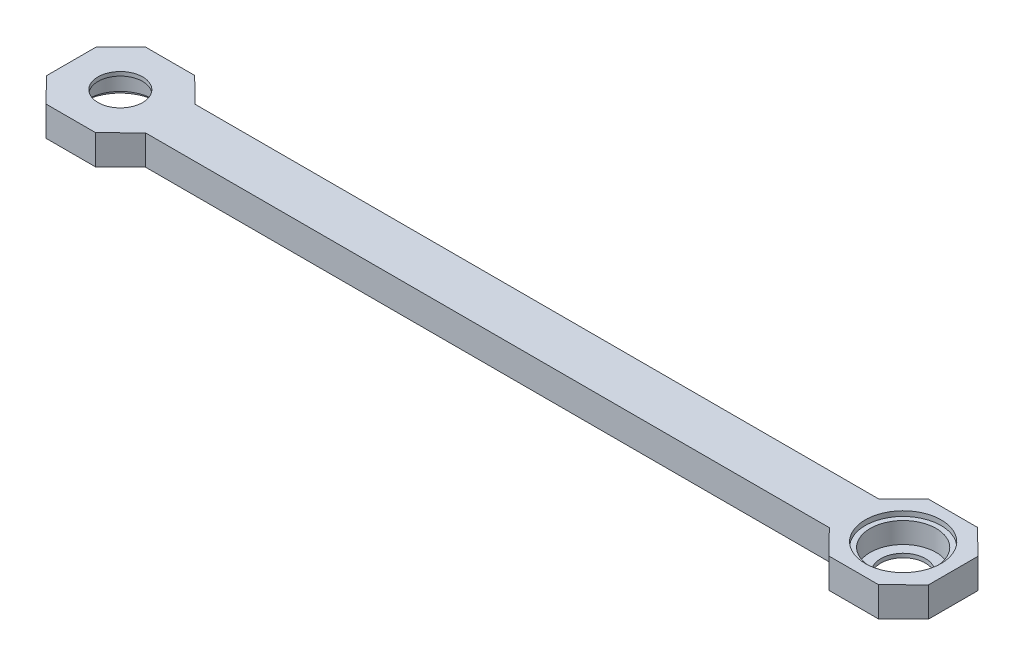
ISO-10303-21;
HEADER;
FILE_DESCRIPTION(('STEP AP214'),'2;1');
FILE_NAME('part.step','',(''),(''),'','','');
FILE_SCHEMA(('AUTOMOTIVE_DESIGN { 1 0 10303 214 1 1 1 1 }'));
ENDSEC;
DATA;
#1=APPLICATION_CONTEXT('core data for automotive mechanical design processes');
#2=APPLICATION_PROTOCOL_DEFINITION('international standard','automotive_design',2000,#1);
#3=PRODUCT_CONTEXT('',#1,'mechanical');
#4=PRODUCT('Part','Part','',(#3));
#5=PRODUCT_RELATED_PRODUCT_CATEGORY('part','',(#4));
#6=PRODUCT_DEFINITION_FORMATION('','',#4);
#7=PRODUCT_DEFINITION_CONTEXT('part definition',#1,'design');
#8=PRODUCT_DEFINITION('design','',#6,#7);
#9=PRODUCT_DEFINITION_SHAPE('','',#8);
#10=(LENGTH_UNIT() NAMED_UNIT(*) SI_UNIT(.MILLI.,.METRE.));
#11=(NAMED_UNIT(*) PLANE_ANGLE_UNIT() SI_UNIT($,.RADIAN.));
#12=(NAMED_UNIT(*) SI_UNIT($,.STERADIAN.) SOLID_ANGLE_UNIT());
#13=UNCERTAINTY_MEASURE_WITH_UNIT(LENGTH_MEASURE(1.E-05),#10,'distance_accuracy_value','');
#14=(GEOMETRIC_REPRESENTATION_CONTEXT(3) GLOBAL_UNCERTAINTY_ASSIGNED_CONTEXT((#13)) GLOBAL_UNIT_ASSIGNED_CONTEXT((#10,
#11,#12)) REPRESENTATION_CONTEXT('',''));
#15=CARTESIAN_POINT('',(0.,0.,0.));
#16=DIRECTION('',(0.,0.,1.));
#17=DIRECTION('',(1.,0.,0.));
#18=AXIS2_PLACEMENT_3D('',#15,#16,#17);
#19=CARTESIAN_POINT('',(-75.3633444841573,5.2,0.));
#20=DIRECTION('',(0.,-1.,0.));
#21=DIRECTION('',(0.,0.,-1.));
#22=AXIS2_PLACEMENT_3D('',#19,#20,#21);
#23=CYLINDRICAL_SURFACE('',#22,6.65000000000001);
#24=CARTESIAN_POINT('',(-75.3633444841573,5.2,0.));
#25=DIRECTION('',(0.,-1.,0.));
#26=DIRECTION('',(0.,0.,-1.));
#27=AXIS2_PLACEMENT_3D('',#24,#25,#26);
#28=CIRCLE('',#27,6.65000000000001);
#29=CARTESIAN_POINT('',(-75.3633444841573,5.2,-6.65000000000001));
#30=VERTEX_POINT('',#29);
#31=EDGE_CURVE('E261',#30,#30,#28,.T.);
#32=ORIENTED_EDGE('',*,*,#31,.F.);
#33=EDGE_LOOP('',(#32));
#34=FACE_BOUND('',#33,.T.);
#35=CARTESIAN_POINT('',(-75.3633444841573,1.,0.));
#36=DIRECTION('',(0.,-1.,0.));
#37=DIRECTION('',(0.,0.,-1.));
#38=AXIS2_PLACEMENT_3D('',#35,#36,#37);
#39=CIRCLE('',#38,6.65000000000001);
#40=CARTESIAN_POINT('',(-75.3633444841573,1.,-6.65000000000001));
#41=VERTEX_POINT('',#40);
#42=EDGE_CURVE('E39',#41,#41,#39,.F.);
#43=ORIENTED_EDGE('',*,*,#42,.F.);
#44=EDGE_LOOP('',(#43));
#45=FACE_BOUND('',#44,.T.);
#46=ADVANCED_FACE('F35',(#34,#45),#23,.F.);
#47=CARTESIAN_POINT('',(-75.3633444841573,6.,0.));
#48=DIRECTION('',(0.,-1.,0.));
#49=DIRECTION('',(0.,0.,-1.));
#50=AXIS2_PLACEMENT_3D('',#47,#48,#49);
#51=CYLINDRICAL_SURFACE('',#50,4.5);
#52=CARTESIAN_POINT('',(-75.3633444841573,6.,0.));
#53=DIRECTION('',(0.,1.,0.));
#54=DIRECTION('',(0.,0.,1.));
#55=AXIS2_PLACEMENT_3D('',#52,#53,#54);
#56=CIRCLE('',#55,4.5);
#57=CARTESIAN_POINT('',(-75.3633444841573,6.,4.5));
#58=VERTEX_POINT('',#57);
#59=EDGE_CURVE('E187',#58,#58,#56,.T.);
#60=ORIENTED_EDGE('',*,*,#59,.T.);
#61=EDGE_LOOP('',(#60));
#62=FACE_BOUND('',#61,.T.);
#63=CARTESIAN_POINT('',(-75.3633444841573,5.2,0.));
#64=DIRECTION('',(0.,-1.,0.));
#65=DIRECTION('',(0.,0.,-1.));
#66=AXIS2_PLACEMENT_3D('',#63,#64,#65);
#67=CIRCLE('',#66,4.5);
#68=CARTESIAN_POINT('',(-75.3633444841573,5.2,-4.5));
#69=VERTEX_POINT('',#68);
#70=EDGE_CURVE('E258',#69,#69,#67,.T.);
#71=ORIENTED_EDGE('',*,*,#70,.T.);
#72=EDGE_LOOP('',(#71));
#73=FACE_BOUND('',#72,.T.);
#74=ADVANCED_FACE('F337',(#62,#73),#51,.F.);
#75=CARTESIAN_POINT('',(82.6366555158427,0.8,0.));
#76=DIRECTION('',(0.,1.,0.));
#77=DIRECTION('',(0.,0.,1.));
#78=AXIS2_PLACEMENT_3D('',#75,#76,#77);
#79=CYLINDRICAL_SURFACE('',#78,6.65000000000001);
#80=CARTESIAN_POINT('',(82.6366555158427,0.8,0.));
#81=DIRECTION('',(0.,1.,0.));
#82=DIRECTION('',(0.,0.,1.));
#83=AXIS2_PLACEMENT_3D('',#80,#81,#82);
#84=CIRCLE('',#83,6.65000000000001);
#85=CARTESIAN_POINT('',(82.6366555158427,0.8,6.65000000000001));
#86=VERTEX_POINT('',#85);
#87=EDGE_CURVE('E254',#86,#86,#84,.T.);
#88=ORIENTED_EDGE('',*,*,#87,.F.);
#89=EDGE_LOOP('',(#88));
#90=FACE_BOUND('',#89,.T.);
#91=CARTESIAN_POINT('',(82.6366555158427,5.,0.));
#92=DIRECTION('',(0.,1.,0.));
#93=DIRECTION('',(0.,0.,1.));
#94=AXIS2_PLACEMENT_3D('',#91,#92,#93);
#95=CIRCLE('',#94,6.65000000000001);
#96=CARTESIAN_POINT('',(82.6366555158427,5.,6.65000000000001));
#97=VERTEX_POINT('',#96);
#98=EDGE_CURVE('E255',#97,#97,#95,.F.);
#99=ORIENTED_EDGE('',*,*,#98,.F.);
#100=EDGE_LOOP('',(#99));
#101=FACE_BOUND('',#100,.T.);
#102=ADVANCED_FACE('F343',(#90,#101),#79,.F.);
#103=CARTESIAN_POINT('',(82.6366555158427,6.,0.));
#104=DIRECTION('',(0.,-1.,0.));
#105=DIRECTION('',(0.,0.,-1.));
#106=AXIS2_PLACEMENT_3D('',#103,#104,#105);
#107=CYLINDRICAL_SURFACE('',#106,4.5);
#108=CARTESIAN_POINT('',(82.6366555158427,0.,0.));
#109=DIRECTION('',(0.,1.,0.));
#110=DIRECTION('',(0.,0.,1.));
#111=AXIS2_PLACEMENT_3D('',#108,#109,#110);
#112=CIRCLE('',#111,4.5);
#113=CARTESIAN_POINT('',(82.6366555158427,0.,4.5));
#114=VERTEX_POINT('',#113);
#115=EDGE_CURVE('E253',#114,#114,#112,.T.);
#116=ORIENTED_EDGE('',*,*,#115,.F.);
#117=EDGE_LOOP('',(#116));
#118=FACE_BOUND('',#117,.T.);
#119=CARTESIAN_POINT('',(82.6366555158427,0.8,0.));
#120=DIRECTION('',(0.,1.,0.));
#121=DIRECTION('',(0.,0.,1.));
#122=AXIS2_PLACEMENT_3D('',#119,#120,#121);
#123=CIRCLE('',#122,4.5);
#124=CARTESIAN_POINT('',(82.6366555158427,0.8,4.5));
#125=VERTEX_POINT('',#124);
#126=EDGE_CURVE('E250',#125,#125,#123,.T.);
#127=ORIENTED_EDGE('',*,*,#126,.T.);
#128=EDGE_LOOP('',(#127));
#129=FACE_BOUND('',#128,.T.);
#130=ADVANCED_FACE('F360',(#118,#129),#107,.F.);
#131=CARTESIAN_POINT('',(0.,6.,0.));
#132=DIRECTION('',(0.,-1.,0.));
#133=DIRECTION('',(0.,0.,-1.));
#134=AXIS2_PLACEMENT_3D('',#131,#132,#133);
#135=PLANE('',#134);
#136=CARTESIAN_POINT('',(82.6366555158427,6.,0.));
#137=DIRECTION('',(0.,1.,0.));
#138=DIRECTION('',(0.,0.,1.));
#139=AXIS2_PLACEMENT_3D('',#136,#137,#138);
#140=CIRCLE('',#139,7.65);
#141=CARTESIAN_POINT('',(82.6366555158427,6.,7.65));
#142=VERTEX_POINT('',#141);
#143=EDGE_CURVE('E260',#142,#142,#140,.T.);
#144=ORIENTED_EDGE('',*,*,#143,.F.);
#145=EDGE_LOOP('',(#144));
#146=FACE_BOUND('',#145,.T.);
#147=DIRECTION('',(-1.,0.,0.));
#148=VECTOR('',#147,1.);
#149=CARTESIAN_POINT('',(-65.2623239697237,6.,-5.));
#150=LINE('',#149,#148);
#151=CARTESIAN_POINT('',(72.7376760302763,6.,-5.));
#152=VERTEX_POINT('',#151);
#153=CARTESIAN_POINT('',(-65.2623239697237,6.,-5.));
#154=VERTEX_POINT('',#153);
#155=EDGE_CURVE('E214',#152,#154,#150,.T.);
#156=ORIENTED_EDGE('',*,*,#155,.T.);
#157=DIRECTION('',(-0.714142857145832,0.,-0.699999985419706));
#158=VECTOR('',#157,1.);
#159=CARTESIAN_POINT('',(-65.2623239697237,6.,-5.));
#160=LINE('',#159,#158);
#161=CARTESIAN_POINT('',(-70.3633444841573,6.,-10.));
#162=VERTEX_POINT('',#161);
#163=EDGE_CURVE('E121',#154,#162,#160,.T.);
#164=ORIENTED_EDGE('',*,*,#163,.T.);
#165=DIRECTION('',(-1.,0.,0.));
#166=VECTOR('',#165,1.);
#167=CARTESIAN_POINT('',(-70.3633444841573,6.,-10.));
#168=LINE('',#167,#166);
#169=CARTESIAN_POINT('',(-80.3633444841573,6.,-10.));
#170=VERTEX_POINT('',#169);
#171=EDGE_CURVE('E286',#162,#170,#168,.T.);
#172=ORIENTED_EDGE('',*,*,#171,.T.);
#173=DIRECTION('',(-0.699854212223766,0.,0.714285714285714));
#174=VECTOR('',#173,1.);
#175=CARTESIAN_POINT('',(-80.3633444841573,6.,-10.));
#176=LINE('',#175,#174);
#177=CARTESIAN_POINT('',(-85.2623239697237,6.,-5.));
#178=VERTEX_POINT('',#177);
#179=EDGE_CURVE('E288',#170,#178,#176,.T.);
#180=ORIENTED_EDGE('',*,*,#179,.T.);
#181=DIRECTION('',(0.,0.,1.));
#182=VECTOR('',#181,1.);
#183=CARTESIAN_POINT('',(-85.2623239697237,6.,-5.));
#184=LINE('',#183,#182);
#185=CARTESIAN_POINT('',(-85.2623239697237,6.,5.));
#186=VERTEX_POINT('',#185);
#187=EDGE_CURVE('E290',#178,#186,#184,.T.);
#188=ORIENTED_EDGE('',*,*,#187,.T.);
#189=DIRECTION('',(0.699854212223766,0.,0.714285714285714));
#190=VECTOR('',#189,1.);
#191=CARTESIAN_POINT('',(-80.3633444841573,6.,10.));
#192=LINE('',#191,#190);
#193=CARTESIAN_POINT('',(-80.3633444841573,6.,10.));
#194=VERTEX_POINT('',#193);
#195=EDGE_CURVE('E292',#186,#194,#192,.T.);
#196=ORIENTED_EDGE('',*,*,#195,.T.);
#197=DIRECTION('',(1.,0.,0.));
#198=VECTOR('',#197,1.);
#199=CARTESIAN_POINT('',(-70.3633444841573,6.,10.));
#200=LINE('',#199,#198);
#201=CARTESIAN_POINT('',(-70.3633444841573,6.,10.));
#202=VERTEX_POINT('',#201);
#203=EDGE_CURVE('E294',#194,#202,#200,.T.);
#204=ORIENTED_EDGE('',*,*,#203,.T.);
#205=DIRECTION('',(0.714142857145832,0.,-0.699999985419706));
#206=VECTOR('',#205,1.);
#207=CARTESIAN_POINT('',(-65.2623239697237,6.,5.));
#208=LINE('',#207,#206);
#209=CARTESIAN_POINT('',(-65.2623239697237,6.,5.));
#210=VERTEX_POINT('',#209);
#211=EDGE_CURVE('E296',#202,#210,#208,.T.);
#212=ORIENTED_EDGE('',*,*,#211,.T.);
#213=DIRECTION('',(1.,0.,0.));
#214=VECTOR('',#213,1.);
#215=CARTESIAN_POINT('',(72.7376760302763,6.,5.));
#216=LINE('',#215,#214);
#217=CARTESIAN_POINT('',(72.7376760302763,6.,5.));
#218=VERTEX_POINT('',#217);
#219=EDGE_CURVE('E298',#210,#218,#216,.T.);
#220=ORIENTED_EDGE('',*,*,#219,.T.);
#221=DIRECTION('',(0.699854212223765,0.,0.714285714285715));
#222=VECTOR('',#221,1.);
#223=CARTESIAN_POINT('',(72.7376760302763,6.,5.));
#224=LINE('',#223,#222);
#225=CARTESIAN_POINT('',(77.6366555158427,6.,10.));
#226=VERTEX_POINT('',#225);
#227=EDGE_CURVE('E300',#218,#226,#224,.T.);
#228=ORIENTED_EDGE('',*,*,#227,.T.);
#229=DIRECTION('',(1.,0.,0.));
#230=VECTOR('',#229,1.);
#231=CARTESIAN_POINT('',(77.6366555158427,6.,10.));
#232=LINE('',#231,#230);
#233=CARTESIAN_POINT('',(87.6366555158427,6.,10.));
#234=VERTEX_POINT('',#233);
#235=EDGE_CURVE('E302',#226,#234,#232,.T.);
#236=ORIENTED_EDGE('',*,*,#235,.T.);
#237=DIRECTION('',(0.714285714285716,0.,-0.699854212223764));
#238=VECTOR('',#237,1.);
#239=CARTESIAN_POINT('',(87.6366555158427,6.,10.));
#240=LINE('',#239,#238);
#241=CARTESIAN_POINT('',(92.739759146641,6.,5.));
#242=VERTEX_POINT('',#241);
#243=EDGE_CURVE('E304',#234,#242,#240,.T.);
#244=ORIENTED_EDGE('',*,*,#243,.T.);
#245=DIRECTION('',(0.,0.,-1.));
#246=VECTOR('',#245,1.);
#247=CARTESIAN_POINT('',(92.739759146641,6.,-5.));
#248=LINE('',#247,#246);
#249=CARTESIAN_POINT('',(92.739759146641,6.,-5.));
#250=VERTEX_POINT('',#249);
#251=EDGE_CURVE('E165',#242,#250,#248,.T.);
#252=ORIENTED_EDGE('',*,*,#251,.T.);
#253=DIRECTION('',(-0.714285714285716,0.,-0.699854212223764));
#254=VECTOR('',#253,1.);
#255=CARTESIAN_POINT('',(87.6366555158427,6.,-10.));
#256=LINE('',#255,#254);
#257=CARTESIAN_POINT('',(87.6366555158427,6.,-10.));
#258=VERTEX_POINT('',#257);
#259=EDGE_CURVE('E158',#250,#258,#256,.T.);
#260=ORIENTED_EDGE('',*,*,#259,.T.);
#261=DIRECTION('',(-1.,0.,0.));
#262=VECTOR('',#261,1.);
#263=CARTESIAN_POINT('',(77.6366555158427,6.,-10.));
#264=LINE('',#263,#262);
#265=CARTESIAN_POINT('',(77.6366555158427,6.,-10.));
#266=VERTEX_POINT('',#265);
#267=EDGE_CURVE('E163',#258,#266,#264,.T.);
#268=ORIENTED_EDGE('',*,*,#267,.T.);
#269=DIRECTION('',(-0.699854212223765,0.,0.714285714285715));
#270=VECTOR('',#269,1.);
#271=CARTESIAN_POINT('',(72.7376760302763,6.,-5.));
#272=LINE('',#271,#270);
#273=EDGE_CURVE('E54',#266,#152,#272,.T.);
#274=ORIENTED_EDGE('',*,*,#273,.T.);
#275=EDGE_LOOP('',(#156,#164,#172,#180,#188,#196,#204,#212,#220,#228,#236,#244,#252,#260,#268,#274));
#276=FACE_BOUND('',#275,.T.);
#277=ORIENTED_EDGE('',*,*,#59,.F.);
#278=EDGE_LOOP('',(#277));
#279=FACE_BOUND('',#278,.T.);
#280=ADVANCED_FACE('F160',(#146,#276,#279),#135,.F.);
#281=CARTESIAN_POINT('',(0.,0.,0.));
#282=DIRECTION('',(0.,-1.,0.));
#283=DIRECTION('',(0.,0.,-1.));
#284=AXIS2_PLACEMENT_3D('',#281,#282,#283);
#285=PLANE('',#284);
#286=CARTESIAN_POINT('',(-75.3633444841573,0.,0.));
#287=DIRECTION('',(0.,-1.,0.));
#288=DIRECTION('',(0.,0.,-1.));
#289=AXIS2_PLACEMENT_3D('',#286,#287,#288);
#290=CIRCLE('',#289,7.65);
#291=CARTESIAN_POINT('',(-75.3633444841573,0.,-7.65));
#292=VERTEX_POINT('',#291);
#293=EDGE_CURVE('E274',#292,#292,#290,.T.);
#294=ORIENTED_EDGE('',*,*,#293,.F.);
#295=EDGE_LOOP('',(#294));
#296=FACE_BOUND('',#295,.T.);
#297=DIRECTION('',(-1.,0.,0.));
#298=VECTOR('',#297,1.);
#299=CARTESIAN_POINT('',(-65.2623239697237,0.,-5.));
#300=LINE('',#299,#298);
#301=CARTESIAN_POINT('',(72.7376760302763,0.,-5.));
#302=VERTEX_POINT('',#301);
#303=CARTESIAN_POINT('',(-65.2623239697237,0.,-5.));
#304=VERTEX_POINT('',#303);
#305=EDGE_CURVE('E183',#302,#304,#300,.T.);
#306=ORIENTED_EDGE('',*,*,#305,.F.);
#307=DIRECTION('',(-0.699854212223765,0.,0.714285714285715));
#308=VECTOR('',#307,1.);
#309=CARTESIAN_POINT('',(72.7376760302763,0.,-5.));
#310=LINE('',#309,#308);
#311=CARTESIAN_POINT('',(77.6366555158427,0.,-10.));
#312=VERTEX_POINT('',#311);
#313=EDGE_CURVE('E113',#312,#302,#310,.T.);
#314=ORIENTED_EDGE('',*,*,#313,.F.);
#315=DIRECTION('',(-1.,0.,0.));
#316=VECTOR('',#315,1.);
#317=CARTESIAN_POINT('',(77.6366555158427,0.,-10.));
#318=LINE('',#317,#316);
#319=CARTESIAN_POINT('',(87.6366555158427,0.,-10.));
#320=VERTEX_POINT('',#319);
#321=EDGE_CURVE('E107',#320,#312,#318,.T.);
#322=ORIENTED_EDGE('',*,*,#321,.F.);
#323=DIRECTION('',(-0.714285714285716,0.,-0.699854212223764));
#324=VECTOR('',#323,1.);
#325=CARTESIAN_POINT('',(87.6366555158427,0.,-10.));
#326=LINE('',#325,#324);
#327=CARTESIAN_POINT('',(92.739759146641,0.,-5.));
#328=VERTEX_POINT('',#327);
#329=EDGE_CURVE('E173',#328,#320,#326,.T.);
#330=ORIENTED_EDGE('',*,*,#329,.F.);
#331=DIRECTION('',(0.,0.,-1.));
#332=VECTOR('',#331,1.);
#333=CARTESIAN_POINT('',(92.739759146641,0.,-5.));
#334=LINE('',#333,#332);
#335=CARTESIAN_POINT('',(92.739759146641,0.,5.));
#336=VERTEX_POINT('',#335);
#337=EDGE_CURVE('E209',#336,#328,#334,.T.);
#338=ORIENTED_EDGE('',*,*,#337,.F.);
#339=DIRECTION('',(0.714285714285716,0.,-0.699854212223764));
#340=VECTOR('',#339,1.);
#341=CARTESIAN_POINT('',(87.6366555158427,0.,10.));
#342=LINE('',#341,#340);
#343=CARTESIAN_POINT('',(87.6366555158427,0.,10.));
#344=VERTEX_POINT('',#343);
#345=EDGE_CURVE('E207',#344,#336,#342,.T.);
#346=ORIENTED_EDGE('',*,*,#345,.F.);
#347=DIRECTION('',(1.,0.,0.));
#348=VECTOR('',#347,1.);
#349=CARTESIAN_POINT('',(77.6366555158427,0.,10.));
#350=LINE('',#349,#348);
#351=CARTESIAN_POINT('',(77.6366555158427,0.,10.));
#352=VERTEX_POINT('',#351);
#353=EDGE_CURVE('E205',#352,#344,#350,.T.);
#354=ORIENTED_EDGE('',*,*,#353,.F.);
#355=DIRECTION('',(0.699854212223765,0.,0.714285714285715));
#356=VECTOR('',#355,1.);
#357=CARTESIAN_POINT('',(72.7376760302763,0.,5.));
#358=LINE('',#357,#356);
#359=CARTESIAN_POINT('',(72.7376760302763,0.,5.));
#360=VERTEX_POINT('',#359);
#361=EDGE_CURVE('E203',#360,#352,#358,.T.);
#362=ORIENTED_EDGE('',*,*,#361,.F.);
#363=DIRECTION('',(1.,0.,0.));
#364=VECTOR('',#363,1.);
#365=CARTESIAN_POINT('',(72.7376760302763,0.,5.));
#366=LINE('',#365,#364);
#367=CARTESIAN_POINT('',(-65.2623239697237,0.,5.));
#368=VERTEX_POINT('',#367);
#369=EDGE_CURVE('E201',#368,#360,#366,.T.);
#370=ORIENTED_EDGE('',*,*,#369,.F.);
#371=DIRECTION('',(0.714142857145832,0.,-0.699999985419706));
#372=VECTOR('',#371,1.);
#373=CARTESIAN_POINT('',(-65.2623239697237,0.,5.));
#374=LINE('',#373,#372);
#375=CARTESIAN_POINT('',(-70.3633444841573,0.,10.));
#376=VERTEX_POINT('',#375);
#377=EDGE_CURVE('E199',#376,#368,#374,.T.);
#378=ORIENTED_EDGE('',*,*,#377,.F.);
#379=DIRECTION('',(1.,0.,0.));
#380=VECTOR('',#379,1.);
#381=CARTESIAN_POINT('',(-70.3633444841573,0.,10.));
#382=LINE('',#381,#380);
#383=CARTESIAN_POINT('',(-80.3633444841573,0.,10.));
#384=VERTEX_POINT('',#383);
#385=EDGE_CURVE('E197',#384,#376,#382,.T.);
#386=ORIENTED_EDGE('',*,*,#385,.F.);
#387=DIRECTION('',(0.699854212223766,0.,0.714285714285714));
#388=VECTOR('',#387,1.);
#389=CARTESIAN_POINT('',(-80.3633444841573,0.,10.));
#390=LINE('',#389,#388);
#391=CARTESIAN_POINT('',(-85.2623239697237,0.,5.));
#392=VERTEX_POINT('',#391);
#393=EDGE_CURVE('E195',#392,#384,#390,.T.);
#394=ORIENTED_EDGE('',*,*,#393,.F.);
#395=DIRECTION('',(0.,0.,1.));
#396=VECTOR('',#395,1.);
#397=CARTESIAN_POINT('',(-85.2623239697237,0.,-5.));
#398=LINE('',#397,#396);
#399=CARTESIAN_POINT('',(-85.2623239697237,0.,-5.));
#400=VERTEX_POINT('',#399);
#401=EDGE_CURVE('E193',#400,#392,#398,.T.);
#402=ORIENTED_EDGE('',*,*,#401,.F.);
#403=DIRECTION('',(-0.699854212223766,0.,0.714285714285714));
#404=VECTOR('',#403,1.);
#405=CARTESIAN_POINT('',(-80.3633444841573,0.,-10.));
#406=LINE('',#405,#404);
#407=CARTESIAN_POINT('',(-80.3633444841573,0.,-10.));
#408=VERTEX_POINT('',#407);
#409=EDGE_CURVE('E191',#408,#400,#406,.T.);
#410=ORIENTED_EDGE('',*,*,#409,.F.);
#411=DIRECTION('',(-1.,0.,0.));
#412=VECTOR('',#411,1.);
#413=CARTESIAN_POINT('',(-70.3633444841573,0.,-10.));
#414=LINE('',#413,#412);
#415=CARTESIAN_POINT('',(-70.3633444841573,0.,-10.));
#416=VERTEX_POINT('',#415);
#417=EDGE_CURVE('E189',#416,#408,#414,.T.);
#418=ORIENTED_EDGE('',*,*,#417,.F.);
#419=DIRECTION('',(-0.714142857145832,0.,-0.699999985419706));
#420=VECTOR('',#419,1.);
#421=CARTESIAN_POINT('',(-65.2623239697237,0.,-5.));
#422=LINE('',#421,#420);
#423=EDGE_CURVE('E186',#304,#416,#422,.T.);
#424=ORIENTED_EDGE('',*,*,#423,.F.);
#425=EDGE_LOOP('',(#306,#314,#322,#330,#338,#346,#354,#362,#370,#378,#386,#394,#402,#410,#418,#424));
#426=FACE_BOUND('',#425,.T.);
#427=ORIENTED_EDGE('',*,*,#115,.T.);
#428=EDGE_LOOP('',(#427));
#429=FACE_BOUND('',#428,.T.);
#430=ADVANCED_FACE('F317',(#296,#426,#429),#285,.T.);
#431=CARTESIAN_POINT('',(-65.2623239697237,6.,-5.));
#432=DIRECTION('',(0.,0.,1.));
#433=DIRECTION('',(1.,0.,0.));
#434=AXIS2_PLACEMENT_3D('',#431,#432,#433);
#435=PLANE('',#434);
#436=ORIENTED_EDGE('',*,*,#305,.T.);
#437=DIRECTION('',(0.,-1.,0.));
#438=VECTOR('',#437,1.);
#439=CARTESIAN_POINT('',(-65.2623239697237,6.,-5.));
#440=LINE('',#439,#438);
#441=EDGE_CURVE('E11',#154,#304,#440,.T.);
#442=ORIENTED_EDGE('',*,*,#441,.F.);
#443=ORIENTED_EDGE('',*,*,#155,.F.);
#444=DIRECTION('',(0.,-1.,0.));
#445=VECTOR('',#444,1.);
#446=CARTESIAN_POINT('',(72.7376760302763,6.,-5.));
#447=LINE('',#446,#445);
#448=EDGE_CURVE('E179',#152,#302,#447,.T.);
#449=ORIENTED_EDGE('',*,*,#448,.T.);
#450=EDGE_LOOP('',(#436,#442,#443,#449));
#451=FACE_BOUND('',#450,.T.);
#452=ADVANCED_FACE('F37',(#451),#435,.F.);
#453=CARTESIAN_POINT('',(-65.2623239697237,6.,-5.));
#454=DIRECTION('',(-0.699999985419706,0.,0.714142857145832));
#455=DIRECTION('',(0.714142857145832,0.,0.699999985419706));
#456=AXIS2_PLACEMENT_3D('',#453,#454,#455);
#457=PLANE('',#456);
#458=ORIENTED_EDGE('',*,*,#423,.T.);
#459=DIRECTION('',(0.,-1.,0.));
#460=VECTOR('',#459,1.);
#461=CARTESIAN_POINT('',(-70.3633444841573,6.,-10.));
#462=LINE('',#461,#460);
#463=EDGE_CURVE('E45',#162,#416,#462,.T.);
#464=ORIENTED_EDGE('',*,*,#463,.F.);
#465=ORIENTED_EDGE('',*,*,#163,.F.);
#466=ORIENTED_EDGE('',*,*,#441,.T.);
#467=EDGE_LOOP('',(#458,#464,#465,#466));
#468=FACE_BOUND('',#467,.T.);
#469=ADVANCED_FACE('F372',(#468),#457,.F.);
#470=CARTESIAN_POINT('',(-70.3633444841573,6.,-10.));
#471=DIRECTION('',(0.,0.,1.));
#472=DIRECTION('',(1.,0.,0.));
#473=AXIS2_PLACEMENT_3D('',#470,#471,#472);
#474=PLANE('',#473);
#475=ORIENTED_EDGE('',*,*,#417,.T.);
#476=DIRECTION('',(0.,-1.,0.));
#477=VECTOR('',#476,1.);
#478=CARTESIAN_POINT('',(-80.3633444841573,6.,-10.));
#479=LINE('',#478,#477);
#480=EDGE_CURVE('E245',#170,#408,#479,.T.);
#481=ORIENTED_EDGE('',*,*,#480,.F.);
#482=ORIENTED_EDGE('',*,*,#171,.F.);
#483=ORIENTED_EDGE('',*,*,#463,.T.);
#484=EDGE_LOOP('',(#475,#481,#482,#483));
#485=FACE_BOUND('',#484,.T.);
#486=ADVANCED_FACE('F442',(#485),#474,.F.);
#487=CARTESIAN_POINT('',(-80.3633444841573,6.,-10.));
#488=DIRECTION('',(0.714285714285714,0.,0.699854212223766));
#489=DIRECTION('',(0.699854212223766,0.,-0.714285714285714));
#490=AXIS2_PLACEMENT_3D('',#487,#488,#489);
#491=PLANE('',#490);
#492=ORIENTED_EDGE('',*,*,#409,.T.);
#493=DIRECTION('',(0.,-1.,0.));
#494=VECTOR('',#493,1.);
#495=CARTESIAN_POINT('',(-85.2623239697237,6.,-5.));
#496=LINE('',#495,#494);
#497=EDGE_CURVE('E242',#178,#400,#496,.T.);
#498=ORIENTED_EDGE('',*,*,#497,.F.);
#499=ORIENTED_EDGE('',*,*,#179,.F.);
#500=ORIENTED_EDGE('',*,*,#480,.T.);
#501=EDGE_LOOP('',(#492,#498,#499,#500));
#502=FACE_BOUND('',#501,.T.);
#503=ADVANCED_FACE('F449',(#502),#491,.F.);
#504=CARTESIAN_POINT('',(-85.2623239697237,6.,-5.));
#505=DIRECTION('',(1.,0.,0.));
#506=DIRECTION('',(0.,0.,-1.));
#507=AXIS2_PLACEMENT_3D('',#504,#505,#506);
#508=PLANE('',#507);
#509=ORIENTED_EDGE('',*,*,#401,.T.);
#510=DIRECTION('',(0.,-1.,0.));
#511=VECTOR('',#510,1.);
#512=CARTESIAN_POINT('',(-85.2623239697237,6.,5.));
#513=LINE('',#512,#511);
#514=EDGE_CURVE('E239',#186,#392,#513,.T.);
#515=ORIENTED_EDGE('',*,*,#514,.F.);
#516=ORIENTED_EDGE('',*,*,#187,.F.);
#517=ORIENTED_EDGE('',*,*,#497,.T.);
#518=EDGE_LOOP('',(#509,#515,#516,#517));
#519=FACE_BOUND('',#518,.T.);
#520=ADVANCED_FACE('F458',(#519),#508,.F.);
#521=CARTESIAN_POINT('',(-80.3633444841573,6.,10.));
#522=DIRECTION('',(0.714285714285714,0.,-0.699854212223765));
#523=DIRECTION('',(-0.699854212223765,0.,-0.714285714285714));
#524=AXIS2_PLACEMENT_3D('',#521,#522,#523);
#525=PLANE('',#524);
#526=ORIENTED_EDGE('',*,*,#393,.T.);
#527=DIRECTION('',(0.,-1.,0.));
#528=VECTOR('',#527,1.);
#529=CARTESIAN_POINT('',(-80.3633444841573,6.,10.));
#530=LINE('',#529,#528);
#531=EDGE_CURVE('E236',#194,#384,#530,.T.);
#532=ORIENTED_EDGE('',*,*,#531,.F.);
#533=ORIENTED_EDGE('',*,*,#195,.F.);
#534=ORIENTED_EDGE('',*,*,#514,.T.);
#535=EDGE_LOOP('',(#526,#532,#533,#534));
#536=FACE_BOUND('',#535,.T.);
#537=ADVANCED_FACE('F467',(#536),#525,.F.);
#538=CARTESIAN_POINT('',(-70.3633444841573,6.,10.));
#539=DIRECTION('',(0.,0.,-1.));
#540=DIRECTION('',(-1.,0.,0.));
#541=AXIS2_PLACEMENT_3D('',#538,#539,#540);
#542=PLANE('',#541);
#543=ORIENTED_EDGE('',*,*,#385,.T.);
#544=DIRECTION('',(0.,-1.,0.));
#545=VECTOR('',#544,1.);
#546=CARTESIAN_POINT('',(-70.3633444841573,6.,10.));
#547=LINE('',#546,#545);
#548=EDGE_CURVE('E233',#202,#376,#547,.T.);
#549=ORIENTED_EDGE('',*,*,#548,.F.);
#550=ORIENTED_EDGE('',*,*,#203,.F.);
#551=ORIENTED_EDGE('',*,*,#531,.T.);
#552=EDGE_LOOP('',(#543,#549,#550,#551));
#553=FACE_BOUND('',#552,.T.);
#554=ADVANCED_FACE('F476',(#553),#542,.F.);
#555=CARTESIAN_POINT('',(-65.2623239697237,6.,5.));
#556=DIRECTION('',(-0.699999985419706,0.,-0.714142857145832));
#557=DIRECTION('',(-0.714142857145832,0.,0.699999985419706));
#558=AXIS2_PLACEMENT_3D('',#555,#556,#557);
#559=PLANE('',#558);
#560=ORIENTED_EDGE('',*,*,#377,.T.);
#561=DIRECTION('',(0.,-1.,0.));
#562=VECTOR('',#561,1.);
#563=CARTESIAN_POINT('',(-65.2623239697237,6.,5.));
#564=LINE('',#563,#562);
#565=EDGE_CURVE('E230',#210,#368,#564,.T.);
#566=ORIENTED_EDGE('',*,*,#565,.F.);
#567=ORIENTED_EDGE('',*,*,#211,.F.);
#568=ORIENTED_EDGE('',*,*,#548,.T.);
#569=EDGE_LOOP('',(#560,#566,#567,#568));
#570=FACE_BOUND('',#569,.T.);
#571=ADVANCED_FACE('F485',(#570),#559,.F.);
#572=CARTESIAN_POINT('',(72.7376760302763,6.,5.));
#573=DIRECTION('',(0.,0.,-1.));
#574=DIRECTION('',(-1.,0.,0.));
#575=AXIS2_PLACEMENT_3D('',#572,#573,#574);
#576=PLANE('',#575);
#577=ORIENTED_EDGE('',*,*,#369,.T.);
#578=DIRECTION('',(0.,-1.,0.));
#579=VECTOR('',#578,1.);
#580=CARTESIAN_POINT('',(72.7376760302763,6.,5.));
#581=LINE('',#580,#579);
#582=EDGE_CURVE('E227',#218,#360,#581,.T.);
#583=ORIENTED_EDGE('',*,*,#582,.F.);
#584=ORIENTED_EDGE('',*,*,#219,.F.);
#585=ORIENTED_EDGE('',*,*,#565,.T.);
#586=EDGE_LOOP('',(#577,#583,#584,#585));
#587=FACE_BOUND('',#586,.T.);
#588=ADVANCED_FACE('F494',(#587),#576,.F.);
#589=CARTESIAN_POINT('',(72.7376760302763,6.,5.));
#590=DIRECTION('',(0.714285714285715,0.,-0.699854212223764));
#591=DIRECTION('',(-0.699854212223764,0.,-0.714285714285715));
#592=AXIS2_PLACEMENT_3D('',#589,#590,#591);
#593=PLANE('',#592);
#594=ORIENTED_EDGE('',*,*,#361,.T.);
#595=DIRECTION('',(0.,-1.,0.));
#596=VECTOR('',#595,1.);
#597=CARTESIAN_POINT('',(77.6366555158427,6.,10.));
#598=LINE('',#597,#596);
#599=EDGE_CURVE('E224',#226,#352,#598,.T.);
#600=ORIENTED_EDGE('',*,*,#599,.F.);
#601=ORIENTED_EDGE('',*,*,#227,.F.);
#602=ORIENTED_EDGE('',*,*,#582,.T.);
#603=EDGE_LOOP('',(#594,#600,#601,#602));
#604=FACE_BOUND('',#603,.T.);
#605=ADVANCED_FACE('F503',(#604),#593,.F.);
#606=CARTESIAN_POINT('',(77.6366555158427,6.,10.));
#607=DIRECTION('',(0.,0.,-1.));
#608=DIRECTION('',(-1.,0.,0.));
#609=AXIS2_PLACEMENT_3D('',#606,#607,#608);
#610=PLANE('',#609);
#611=ORIENTED_EDGE('',*,*,#353,.T.);
#612=DIRECTION('',(0.,-1.,0.));
#613=VECTOR('',#612,1.);
#614=CARTESIAN_POINT('',(87.6366555158427,6.,10.));
#615=LINE('',#614,#613);
#616=EDGE_CURVE('E221',#234,#344,#615,.T.);
#617=ORIENTED_EDGE('',*,*,#616,.F.);
#618=ORIENTED_EDGE('',*,*,#235,.F.);
#619=ORIENTED_EDGE('',*,*,#599,.T.);
#620=EDGE_LOOP('',(#611,#617,#618,#619));
#621=FACE_BOUND('',#620,.T.);
#622=ADVANCED_FACE('F512',(#621),#610,.F.);
#623=CARTESIAN_POINT('',(87.6366555158427,6.,10.));
#624=DIRECTION('',(-0.699854212223764,0.,-0.714285714285716));
#625=DIRECTION('',(-0.714285714285716,0.,0.699854212223764));
#626=AXIS2_PLACEMENT_3D('',#623,#624,#625);
#627=PLANE('',#626);
#628=ORIENTED_EDGE('',*,*,#345,.T.);
#629=DIRECTION('',(0.,-1.,0.));
#630=VECTOR('',#629,1.);
#631=CARTESIAN_POINT('',(92.739759146641,6.,5.));
#632=LINE('',#631,#630);
#633=EDGE_CURVE('E218',#242,#336,#632,.T.);
#634=ORIENTED_EDGE('',*,*,#633,.F.);
#635=ORIENTED_EDGE('',*,*,#243,.F.);
#636=ORIENTED_EDGE('',*,*,#616,.T.);
#637=EDGE_LOOP('',(#628,#634,#635,#636));
#638=FACE_BOUND('',#637,.T.);
#639=ADVANCED_FACE('F310',(#638),#627,.F.);
#640=CARTESIAN_POINT('',(92.739759146641,6.,-5.));
#641=DIRECTION('',(-1.,0.,0.));
#642=DIRECTION('',(0.,0.,1.));
#643=AXIS2_PLACEMENT_3D('',#640,#641,#642);
#644=PLANE('',#643);
#645=ORIENTED_EDGE('',*,*,#337,.T.);
#646=DIRECTION('',(0.,-1.,0.));
#647=VECTOR('',#646,1.);
#648=CARTESIAN_POINT('',(92.739759146641,6.,-5.));
#649=LINE('',#648,#647);
#650=EDGE_CURVE('E174',#250,#328,#649,.T.);
#651=ORIENTED_EDGE('',*,*,#650,.F.);
#652=ORIENTED_EDGE('',*,*,#251,.F.);
#653=ORIENTED_EDGE('',*,*,#633,.T.);
#654=EDGE_LOOP('',(#645,#651,#652,#653));
#655=FACE_BOUND('',#654,.T.);
#656=ADVANCED_FACE('F314',(#655),#644,.F.);
#657=CARTESIAN_POINT('',(87.6366555158427,6.,-10.));
#658=DIRECTION('',(-0.699854212223764,0.,0.714285714285716));
#659=DIRECTION('',(0.714285714285716,0.,0.699854212223764));
#660=AXIS2_PLACEMENT_3D('',#657,#658,#659);
#661=PLANE('',#660);
#662=ORIENTED_EDGE('',*,*,#329,.T.);
#663=DIRECTION('',(0.,-1.,0.));
#664=VECTOR('',#663,1.);
#665=CARTESIAN_POINT('',(87.6366555158427,6.,-10.));
#666=LINE('',#665,#664);
#667=EDGE_CURVE('E170',#258,#320,#666,.T.);
#668=ORIENTED_EDGE('',*,*,#667,.F.);
#669=ORIENTED_EDGE('',*,*,#259,.F.);
#670=ORIENTED_EDGE('',*,*,#650,.T.);
#671=EDGE_LOOP('',(#662,#668,#669,#670));
#672=FACE_BOUND('',#671,.T.);
#673=ADVANCED_FACE('F171',(#672),#661,.F.);
#674=CARTESIAN_POINT('',(77.6366555158427,6.,-10.));
#675=DIRECTION('',(0.,0.,1.));
#676=DIRECTION('',(1.,0.,0.));
#677=AXIS2_PLACEMENT_3D('',#674,#675,#676);
#678=PLANE('',#677);
#679=ORIENTED_EDGE('',*,*,#321,.T.);
#680=DIRECTION('',(0.,-1.,0.));
#681=VECTOR('',#680,1.);
#682=CARTESIAN_POINT('',(77.6366555158427,6.,-10.));
#683=LINE('',#682,#681);
#684=EDGE_CURVE('E175',#266,#312,#683,.T.);
#685=ORIENTED_EDGE('',*,*,#684,.F.);
#686=ORIENTED_EDGE('',*,*,#267,.F.);
#687=ORIENTED_EDGE('',*,*,#667,.T.);
#688=EDGE_LOOP('',(#679,#685,#686,#687));
#689=FACE_BOUND('',#688,.T.);
#690=ADVANCED_FACE('F177',(#689),#678,.F.);
#691=CARTESIAN_POINT('',(72.7376760302763,6.,-5.));
#692=DIRECTION('',(0.714285714285715,0.,0.699854212223764));
#693=DIRECTION('',(0.699854212223764,0.,-0.714285714285715));
#694=AXIS2_PLACEMENT_3D('',#691,#692,#693);
#695=PLANE('',#694);
#696=ORIENTED_EDGE('',*,*,#313,.T.);
#697=ORIENTED_EDGE('',*,*,#448,.F.);
#698=ORIENTED_EDGE('',*,*,#273,.F.);
#699=ORIENTED_EDGE('',*,*,#684,.T.);
#700=EDGE_LOOP('',(#696,#697,#698,#699));
#701=FACE_BOUND('',#700,.T.);
#702=ADVANCED_FACE('F323',(#701),#695,.F.);
#703=CARTESIAN_POINT('',(82.6366555158427,0.8,0.));
#704=DIRECTION('',(0.,1.,0.));
#705=DIRECTION('',(0.,0.,1.));
#706=AXIS2_PLACEMENT_3D('',#703,#704,#705);
#707=PLANE('',#706);
#708=ORIENTED_EDGE('',*,*,#126,.F.);
#709=EDGE_LOOP('',(#708));
#710=FACE_BOUND('',#709,.T.);
#711=ORIENTED_EDGE('',*,*,#87,.T.);
#712=EDGE_LOOP('',(#711));
#713=FACE_BOUND('',#712,.T.);
#714=ADVANCED_FACE('F325',(#710,#713),#707,.T.);
#715=CARTESIAN_POINT('',(82.6366555158427,5.,0.));
#716=DIRECTION('',(0.,1.,0.));
#717=DIRECTION('',(0.,0.,1.));
#718=AXIS2_PLACEMENT_3D('',#715,#716,#717);
#719=PLANE('',#718);
#720=CARTESIAN_POINT('',(82.6366555158427,5.,0.));
#721=DIRECTION('',(0.,1.,0.));
#722=DIRECTION('',(0.,0.,1.));
#723=AXIS2_PLACEMENT_3D('',#720,#721,#722);
#724=CIRCLE('',#723,7.65);
#725=CARTESIAN_POINT('',(82.6366555158427,5.,7.65));
#726=VERTEX_POINT('',#725);
#727=EDGE_CURVE('E257',#726,#726,#724,.T.);
#728=ORIENTED_EDGE('',*,*,#727,.T.);
#729=EDGE_LOOP('',(#728));
#730=FACE_BOUND('',#729,.T.);
#731=ORIENTED_EDGE('',*,*,#98,.T.);
#732=EDGE_LOOP('',(#731));
#733=FACE_BOUND('',#732,.T.);
#734=ADVANCED_FACE('F331',(#730,#733),#719,.T.);
#735=CARTESIAN_POINT('',(82.6366555158427,5.,0.));
#736=DIRECTION('',(0.,1.,0.));
#737=DIRECTION('',(0.,0.,1.));
#738=AXIS2_PLACEMENT_3D('',#735,#736,#737);
#739=CYLINDRICAL_SURFACE('',#738,7.65);
#740=ORIENTED_EDGE('',*,*,#727,.F.);
#741=EDGE_LOOP('',(#740));
#742=FACE_BOUND('',#741,.T.);
#743=ORIENTED_EDGE('',*,*,#143,.T.);
#744=EDGE_LOOP('',(#743));
#745=FACE_BOUND('',#744,.T.);
#746=ADVANCED_FACE('F353',(#742,#745),#739,.F.);
#747=CARTESIAN_POINT('',(-75.3633444841573,5.2,0.));
#748=DIRECTION('',(0.,-1.,0.));
#749=DIRECTION('',(0.,0.,-1.));
#750=AXIS2_PLACEMENT_3D('',#747,#748,#749);
#751=PLANE('',#750);
#752=ORIENTED_EDGE('',*,*,#70,.F.);
#753=EDGE_LOOP('',(#752));
#754=FACE_BOUND('',#753,.T.);
#755=ORIENTED_EDGE('',*,*,#31,.T.);
#756=EDGE_LOOP('',(#755));
#757=FACE_BOUND('',#756,.T.);
#758=ADVANCED_FACE('F349',(#754,#757),#751,.T.);
#759=CARTESIAN_POINT('',(-75.3633444841573,1.,0.));
#760=DIRECTION('',(0.,-1.,0.));
#761=DIRECTION('',(0.,0.,-1.));
#762=AXIS2_PLACEMENT_3D('',#759,#760,#761);
#763=PLANE('',#762);
#764=CARTESIAN_POINT('',(-75.3633444841573,1.,0.));
#765=DIRECTION('',(0.,-1.,0.));
#766=DIRECTION('',(0.,0.,-1.));
#767=AXIS2_PLACEMENT_3D('',#764,#765,#766);
#768=CIRCLE('',#767,7.65);
#769=CARTESIAN_POINT('',(-75.3633444841573,1.,-7.65));
#770=VERTEX_POINT('',#769);
#771=EDGE_CURVE('E271',#770,#770,#768,.T.);
#772=ORIENTED_EDGE('',*,*,#771,.T.);
#773=EDGE_LOOP('',(#772));
#774=FACE_BOUND('',#773,.T.);
#775=ORIENTED_EDGE('',*,*,#42,.T.);
#776=EDGE_LOOP('',(#775));
#777=FACE_BOUND('',#776,.T.);
#778=ADVANCED_FACE('F379',(#774,#777),#763,.T.);
#779=CARTESIAN_POINT('',(-75.3633444841573,1.,0.));
#780=DIRECTION('',(0.,-1.,0.));
#781=DIRECTION('',(0.,0.,-1.));
#782=AXIS2_PLACEMENT_3D('',#779,#780,#781);
#783=CYLINDRICAL_SURFACE('',#782,7.65);
#784=ORIENTED_EDGE('',*,*,#771,.F.);
#785=EDGE_LOOP('',(#784));
#786=FACE_BOUND('',#785,.T.);
#787=ORIENTED_EDGE('',*,*,#293,.T.);
#788=EDGE_LOOP('',(#787));
#789=FACE_BOUND('',#788,.T.);
#790=ADVANCED_FACE('F382',(#786,#789),#783,.F.);
#791=CLOSED_SHELL('',(#46,#74,#102,#130,#280,#430,#452,#469,#486,#503,#520,#537,#554,#571,#588,
#605,#622,#639,#656,#673,#690,#702,#714,#734,#746,#758,#778,#790));
#792=MANIFOLD_SOLID_BREP('B2',#791);
#793=ADVANCED_BREP_SHAPE_REPRESENTATION('',(#18,#792),#14);
#794=SHAPE_DEFINITION_REPRESENTATION(#9,#793);
ENDSEC;
END-ISO-10303-21;
